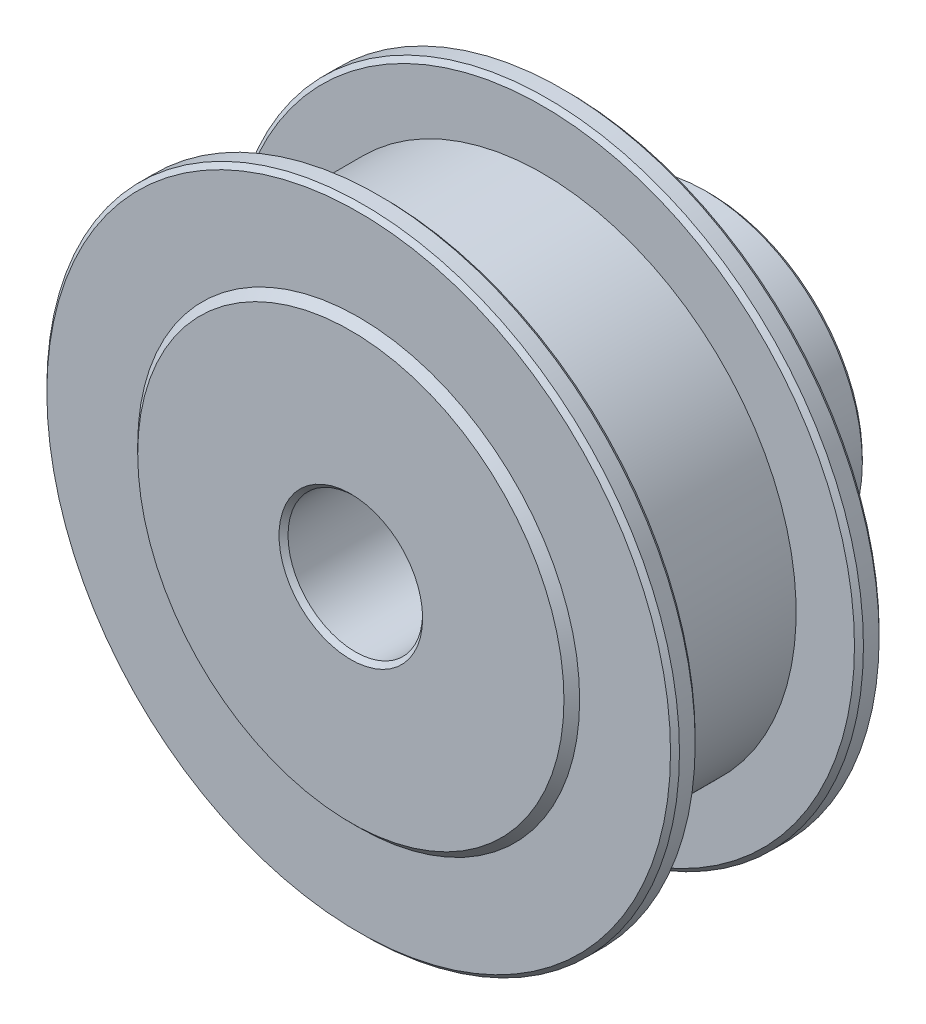
ISO-10303-21;
HEADER;
FILE_DESCRIPTION(('STEP AP214'),'2;1');
FILE_NAME('part.step','',(''),(''),'','','');
FILE_SCHEMA(('AUTOMOTIVE_DESIGN { 1 0 10303 214 1 1 1 1 }'));
ENDSEC;
DATA;
#1=APPLICATION_CONTEXT('core data for automotive mechanical design processes');
#2=APPLICATION_PROTOCOL_DEFINITION('international standard','automotive_design',2000,#1);
#3=PRODUCT_CONTEXT('',#1,'mechanical');
#4=PRODUCT('Part','Part','',(#3));
#5=PRODUCT_RELATED_PRODUCT_CATEGORY('part','',(#4));
#6=PRODUCT_DEFINITION_FORMATION('','',#4);
#7=PRODUCT_DEFINITION_CONTEXT('part definition',#1,'design');
#8=PRODUCT_DEFINITION('design','',#6,#7);
#9=PRODUCT_DEFINITION_SHAPE('','',#8);
#10=(LENGTH_UNIT() NAMED_UNIT(*) SI_UNIT(.MILLI.,.METRE.));
#11=(NAMED_UNIT(*) PLANE_ANGLE_UNIT() SI_UNIT($,.RADIAN.));
#12=(NAMED_UNIT(*) SI_UNIT($,.STERADIAN.) SOLID_ANGLE_UNIT());
#13=UNCERTAINTY_MEASURE_WITH_UNIT(LENGTH_MEASURE(1.E-05),#10,'distance_accuracy_value','');
#14=(GEOMETRIC_REPRESENTATION_CONTEXT(3) GLOBAL_UNCERTAINTY_ASSIGNED_CONTEXT((#13)) GLOBAL_UNIT_ASSIGNED_CONTEXT((#10,
#11,#12)) REPRESENTATION_CONTEXT('',''));
#15=CARTESIAN_POINT('',(0.,0.,0.));
#16=DIRECTION('',(0.,0.,1.));
#17=DIRECTION('',(1.,0.,0.));
#18=AXIS2_PLACEMENT_3D('',#15,#16,#17);
#19=CARTESIAN_POINT('',(0.,0.,9.3));
#20=DIRECTION('',(0.,0.,-1.));
#21=DIRECTION('',(-1.,0.,0.));
#22=AXIS2_PLACEMENT_3D('',#19,#20,#21);
#23=CYLINDRICAL_SURFACE('',#22,14.1);
#24=CARTESIAN_POINT('',(0.,0.,9.09999999999999));
#25=DIRECTION('',(0.,0.,1.));
#26=DIRECTION('',(1.,0.,0.));
#27=AXIS2_PLACEMENT_3D('',#24,#25,#26);
#28=CIRCLE('',#27,14.1);
#29=CARTESIAN_POINT('',(-14.1,0.,9.09999999999999));
#30=VERTEX_POINT('',#29);
#31=EDGE_CURVE('E63',#30,#30,#28,.F.);
#32=CARTESIAN_POINT('',(0.,0.,8.40000000000001));
#33=DIRECTION('',(0.,0.,1.));
#34=DIRECTION('',(1.,0.,0.));
#35=AXIS2_PLACEMENT_3D('',#32,#33,#34);
#36=CIRCLE('',#35,14.1);
#37=CARTESIAN_POINT('',(-14.1,0.,8.40000000000001));
#38=VERTEX_POINT('',#37);
#39=EDGE_CURVE('E66',#38,#38,#36,.T.);
#40=CARTESIAN_POINT('',(-14.1,0.,9.09999999999999));
#41=CARTESIAN_POINT('',(-14.1,0.,9.09270833333332));
#42=CARTESIAN_POINT('',(-14.1,0.,9.08541666666666));
#43=CARTESIAN_POINT('',(-14.1,0.,9.07083333333332));
#44=CARTESIAN_POINT('',(-14.1,0.,9.06354166666666));
#45=CARTESIAN_POINT('',(-14.1,0.,9.04895833333333));
#46=CARTESIAN_POINT('',(-14.1,0.,9.04166666666666));
#47=CARTESIAN_POINT('',(-14.1,0.,9.02708333333333));
#48=CARTESIAN_POINT('',(-14.1,0.,9.01979166666666));
#49=CARTESIAN_POINT('',(-14.1,0.,9.00520833333333));
#50=CARTESIAN_POINT('',(-14.1,0.,8.99791666666666));
#51=CARTESIAN_POINT('',(-14.1,0.,8.98333333333333));
#52=CARTESIAN_POINT('',(-14.1,0.,8.97604166666666));
#53=CARTESIAN_POINT('',(-14.1,0.,8.96145833333333));
#54=CARTESIAN_POINT('',(-14.1,0.,8.95416666666666));
#55=CARTESIAN_POINT('',(-14.1,0.,8.93958333333333));
#56=CARTESIAN_POINT('',(-14.1,0.,8.93229166666666));
#57=CARTESIAN_POINT('',(-14.1,0.,8.91770833333333));
#58=CARTESIAN_POINT('',(-14.1,0.,8.91041666666666));
#59=CARTESIAN_POINT('',(-14.1,0.,8.89583333333333));
#60=CARTESIAN_POINT('',(-14.1,0.,8.88854166666666));
#61=CARTESIAN_POINT('',(-14.1,0.,8.87395833333333));
#62=CARTESIAN_POINT('',(-14.1,0.,8.86666666666666));
#63=CARTESIAN_POINT('',(-14.1,0.,8.85208333333333));
#64=CARTESIAN_POINT('',(-14.1,0.,8.84479166666666));
#65=CARTESIAN_POINT('',(-14.1,0.,8.83020833333333));
#66=CARTESIAN_POINT('',(-14.1,0.,8.82291666666666));
#67=CARTESIAN_POINT('',(-14.1,0.,8.80833333333333));
#68=CARTESIAN_POINT('',(-14.1,0.,8.80104166666666));
#69=CARTESIAN_POINT('',(-14.1,0.,8.78645833333333));
#70=CARTESIAN_POINT('',(-14.1,0.,8.77916666666667));
#71=CARTESIAN_POINT('',(-14.1,0.,8.76458333333333));
#72=CARTESIAN_POINT('',(-14.1,0.,8.75729166666667));
#73=CARTESIAN_POINT('',(-14.1,0.,8.74270833333333));
#74=CARTESIAN_POINT('',(-14.1,0.,8.73541666666667));
#75=CARTESIAN_POINT('',(-14.1,0.,8.72083333333333));
#76=CARTESIAN_POINT('',(-14.1,0.,8.71354166666667));
#77=CARTESIAN_POINT('',(-14.1,0.,8.69895833333334));
#78=CARTESIAN_POINT('',(-14.1,0.,8.69166666666667));
#79=CARTESIAN_POINT('',(-14.1,0.,8.67708333333334));
#80=CARTESIAN_POINT('',(-14.1,0.,8.66979166666667));
#81=CARTESIAN_POINT('',(-14.1,0.,8.65520833333334));
#82=CARTESIAN_POINT('',(-14.1,0.,8.64791666666667));
#83=CARTESIAN_POINT('',(-14.1,0.,8.63333333333334));
#84=CARTESIAN_POINT('',(-14.1,0.,8.62604166666667));
#85=CARTESIAN_POINT('',(-14.1,0.,8.61145833333334));
#86=CARTESIAN_POINT('',(-14.1,0.,8.60416666666667));
#87=CARTESIAN_POINT('',(-14.1,0.,8.58958333333334));
#88=CARTESIAN_POINT('',(-14.1,0.,8.58229166666667));
#89=CARTESIAN_POINT('',(-14.1,0.,8.56770833333334));
#90=CARTESIAN_POINT('',(-14.1,0.,8.56041666666667));
#91=CARTESIAN_POINT('',(-14.1,0.,8.54583333333334));
#92=CARTESIAN_POINT('',(-14.1,0.,8.53854166666667));
#93=CARTESIAN_POINT('',(-14.1,0.,8.52395833333334));
#94=CARTESIAN_POINT('',(-14.1,0.,8.51666666666667));
#95=CARTESIAN_POINT('',(-14.1,0.,8.50208333333334));
#96=CARTESIAN_POINT('',(-14.1,0.,8.49479166666667));
#97=CARTESIAN_POINT('',(-14.1,0.,8.48020833333334));
#98=CARTESIAN_POINT('',(-14.1,0.,8.47291666666668));
#99=CARTESIAN_POINT('',(-14.1,0.,8.45833333333334));
#100=CARTESIAN_POINT('',(-14.1,0.,8.45104166666668));
#101=CARTESIAN_POINT('',(-14.1,0.,8.43645833333334));
#102=CARTESIAN_POINT('',(-14.1,0.,8.42916666666668));
#103=CARTESIAN_POINT('',(-14.1,0.,8.41458333333335));
#104=CARTESIAN_POINT('',(-14.1,0.,8.40729166666668));
#105=CARTESIAN_POINT('',(-14.1,0.,8.40000000000001));
#106=B_SPLINE_CURVE_WITH_KNOTS('',3,(#40,#41,#42,#43,#44,#45,#46,#47,#48,#49,#50,#51,#52,#53,
#54,#55,#56,#57,#58,#59,#60,#61,#62,#63,#64,#65,#66,#67,#68,#69,#70,#71,#72,#73,#74,#75,#76,#77,
#78,#79,#80,#81,#82,#83,#84,#85,#86,#87,#88,#89,#90,#91,#92,#93,#94,#95,#96,#97,#98,#99,#100,
#101,#102,#103,#104,#105),.UNSPECIFIED.,.F.,.F.,(4,2,2,2,2,2,2,2,2,2,2,2,2,2,2,2,2,2,2,2,2,2,2,
2,2,2,2,2,2,2,2,2,4),(0.,0.0218749999999993,0.0437499999999987,0.065624999999998,
0.0874999999999973,0.109374999999997,0.131249999999996,0.153124999999995,0.174999999999995,
0.196874999999994,0.218749999999993,0.240624999999993,0.262499999999992,0.284374999999991,
0.306249999999991,0.32812499999999,0.349999999999989,0.371874999999989,0.393749999999988,
0.415624999999987,0.437499999999987,0.459374999999986,0.481249999999985,0.503124999999985,
0.524999999999984,0.546874999999983,0.568749999999982,0.590624999999982,0.612499999999981,
0.63437499999998,0.65624999999998,0.678124999999977,0.699999999999978),.UNSPECIFIED.);
#107=EDGE_CURVE('BSEAM37',#30,#38,#106,.T.);
#108=ORIENTED_EDGE('',*,*,#31,.T.);
#109=ORIENTED_EDGE('',*,*,#39,.T.);
#110=ORIENTED_EDGE('',*,*,#107,.T.);
#111=ORIENTED_EDGE('',*,*,#107,.F.);
#112=EDGE_LOOP('',(#108,#110,#109,#111));
#113=FACE_BOUND('',#112,.T.);
#114=ADVANCED_FACE('F37',(#113),#23,.T.);
#115=CARTESIAN_POINT('',(0.,0.,9.3));
#116=DIRECTION('',(0.,0.,1.));
#117=DIRECTION('',(1.,0.,0.));
#118=AXIS2_PLACEMENT_3D('',#115,#116,#117);
#119=PLANE('',#118);
#120=CARTESIAN_POINT('',(0.,0.,9.3));
#121=DIRECTION('',(0.,0.,1.));
#122=DIRECTION('',(1.,0.,0.));
#123=AXIS2_PLACEMENT_3D('',#120,#121,#122);
#124=CIRCLE('',#123,13.9);
#125=CARTESIAN_POINT('',(-13.9,0.,9.3));
#126=VERTEX_POINT('',#125);
#127=EDGE_CURVE('E69',#126,#126,#124,.T.);
#128=ORIENTED_EDGE('',*,*,#127,.T.);
#129=EDGE_LOOP('',(#128));
#130=FACE_BOUND('',#129,.T.);
#131=CARTESIAN_POINT('',(0.,0.,9.3));
#132=DIRECTION('',(0.,0.,1.));
#133=DIRECTION('',(1.,0.,0.));
#134=AXIS2_PLACEMENT_3D('',#131,#132,#133);
#135=CIRCLE('',#134,9.85);
#136=CARTESIAN_POINT('',(9.85,0.,9.3));
#137=VERTEX_POINT('',#136);
#138=EDGE_CURVE('E105',#137,#137,#135,.F.);
#139=ORIENTED_EDGE('',*,*,#138,.T.);
#140=EDGE_LOOP('',(#139));
#141=FACE_BOUND('',#140,.T.);
#142=ADVANCED_FACE('F109',(#130,#141),#119,.T.);
#143=CARTESIAN_POINT('',(0.,14.1,8.2));
#144=DIRECTION('',(0.,0.,1.));
#145=DIRECTION('',(1.,0.,0.));
#146=AXIS2_PLACEMENT_3D('',#143,#144,#145);
#147=PLANE('',#146);
#148=CARTESIAN_POINT('',(0.,0.,8.2));
#149=DIRECTION('',(0.,0.,1.));
#150=DIRECTION('',(1.,0.,0.));
#151=AXIS2_PLACEMENT_3D('',#148,#149,#150);
#152=CIRCLE('',#151,13.9);
#153=CARTESIAN_POINT('',(13.9,0.,8.2));
#154=VERTEX_POINT('',#153);
#155=EDGE_CURVE('E60',#154,#154,#152,.F.);
#156=ORIENTED_EDGE('',*,*,#155,.T.);
#157=EDGE_LOOP('',(#156));
#158=FACE_BOUND('',#157,.T.);
#159=CARTESIAN_POINT('',(0.,0.,8.2));
#160=DIRECTION('',(0.,0.,-1.));
#161=DIRECTION('',(-1.,0.,0.));
#162=AXIS2_PLACEMENT_3D('',#159,#160,#161);
#163=CIRCLE('',#162,11.3);
#164=CARTESIAN_POINT('',(-11.3,0.,8.2));
#165=VERTEX_POINT('',#164);
#166=EDGE_CURVE('E99',#165,#165,#163,.T.);
#167=ORIENTED_EDGE('',*,*,#166,.F.);
#168=EDGE_LOOP('',(#167));
#169=FACE_BOUND('',#168,.T.);
#170=ADVANCED_FACE('F136',(#158,#169),#147,.F.);
#171=CARTESIAN_POINT('',(0.,0.,-0.465));
#172=DIRECTION('',(0.,0.,-1.));
#173=DIRECTION('',(-1.,0.,0.));
#174=AXIS2_PLACEMENT_3D('',#171,#172,#173);
#175=CYLINDRICAL_SURFACE('',#174,11.3);
#176=CARTESIAN_POINT('',(0.,0.,1.1));
#177=DIRECTION('',(0.,0.,-1.));
#178=DIRECTION('',(-1.,0.,0.));
#179=AXIS2_PLACEMENT_3D('',#176,#177,#178);
#180=CIRCLE('',#179,11.3);
#181=CARTESIAN_POINT('',(-11.3,0.,1.1));
#182=VERTEX_POINT('',#181);
#183=EDGE_CURVE('E102',#182,#182,#180,.T.);
#184=ORIENTED_EDGE('',*,*,#183,.F.);
#185=EDGE_LOOP('',(#184));
#186=FACE_BOUND('',#185,.T.);
#187=ORIENTED_EDGE('',*,*,#166,.T.);
#188=EDGE_LOOP('',(#187));
#189=FACE_BOUND('',#188,.T.);
#190=ADVANCED_FACE('F290',(#186,#189),#175,.T.);
#191=CARTESIAN_POINT('',(0.,14.1,1.1));
#192=DIRECTION('',(0.,0.,-1.));
#193=DIRECTION('',(-1.,0.,0.));
#194=AXIS2_PLACEMENT_3D('',#191,#192,#193);
#195=PLANE('',#194);
#196=CARTESIAN_POINT('',(0.,0.,1.1));
#197=DIRECTION('',(0.,0.,-1.));
#198=DIRECTION('',(-1.,0.,0.));
#199=AXIS2_PLACEMENT_3D('',#196,#197,#198);
#200=CIRCLE('',#199,13.9);
#201=CARTESIAN_POINT('',(-13.9,0.,1.1));
#202=VERTEX_POINT('',#201);
#203=EDGE_CURVE('E48',#202,#202,#200,.F.);
#204=ORIENTED_EDGE('',*,*,#203,.T.);
#205=EDGE_LOOP('',(#204));
#206=FACE_BOUND('',#205,.T.);
#207=ORIENTED_EDGE('',*,*,#183,.T.);
#208=EDGE_LOOP('',(#207));
#209=FACE_BOUND('',#208,.T.);
#210=ADVANCED_FACE('F147',(#206,#209),#195,.F.);
#211=CARTESIAN_POINT('',(0.,0.,0.));
#212=DIRECTION('',(0.,0.,1.));
#213=DIRECTION('',(1.,0.,0.));
#214=AXIS2_PLACEMENT_3D('',#211,#212,#213);
#215=PLANE('',#214);
#216=CARTESIAN_POINT('',(0.,0.,0.));
#217=DIRECTION('',(0.,0.,1.));
#218=DIRECTION('',(1.,0.,0.));
#219=AXIS2_PLACEMENT_3D('',#216,#217,#218);
#220=CIRCLE('',#219,13.9);
#221=CARTESIAN_POINT('',(13.9,0.,0.));
#222=VERTEX_POINT('',#221);
#223=EDGE_CURVE('E44',#222,#222,#220,.F.);
#224=ORIENTED_EDGE('',*,*,#223,.T.);
#225=EDGE_LOOP('',(#224));
#226=FACE_BOUND('',#225,.T.);
#227=CARTESIAN_POINT('',(0.,0.,0.));
#228=DIRECTION('',(0.,0.,1.));
#229=DIRECTION('',(1.,0.,0.));
#230=AXIS2_PLACEMENT_3D('',#227,#228,#229);
#231=CIRCLE('',#230,9.85);
#232=CARTESIAN_POINT('',(9.85,0.,0.));
#233=VERTEX_POINT('',#232);
#234=EDGE_CURVE('E96',#233,#233,#231,.F.);
#235=ORIENTED_EDGE('',*,*,#234,.F.);
#236=EDGE_LOOP('',(#235));
#237=FACE_BOUND('',#236,.T.);
#238=ADVANCED_FACE('F142',(#226,#237),#215,.F.);
#239=CARTESIAN_POINT('',(0.,0.,0.900000000000001));
#240=DIRECTION('',(0.,0.,-1.));
#241=DIRECTION('',(-1.,0.,0.));
#242=AXIS2_PLACEMENT_3D('',#239,#240,#241);
#243=CIRCLE('',#242,14.1);
#244=CARTESIAN_POINT('',(-14.1,0.,0.900000000000001));
#245=VERTEX_POINT('',#244);
#246=EDGE_CURVE('E52',#245,#245,#243,.T.);
#247=ORIENTED_EDGE('',*,*,#246,.T.);
#248=EDGE_LOOP('',(#247));
#249=FACE_BOUND('',#248,.T.);
#250=CARTESIAN_POINT('',(0.,0.,0.200000000000004));
#251=DIRECTION('',(0.,0.,1.));
#252=DIRECTION('',(1.,0.,0.));
#253=AXIS2_PLACEMENT_3D('',#250,#251,#252);
#254=CIRCLE('',#253,14.1);
#255=CARTESIAN_POINT('',(14.1,0.,0.200000000000004));
#256=VERTEX_POINT('',#255);
#257=EDGE_CURVE('E57',#256,#256,#254,.T.);
#258=ORIENTED_EDGE('',*,*,#257,.T.);
#259=EDGE_LOOP('',(#258));
#260=FACE_BOUND('',#259,.T.);
#261=ADVANCED_FACE('F126',(#249,#260),#23,.T.);
#262=CARTESIAN_POINT('',(0.,0.,-0.35));
#263=DIRECTION('',(0.,0.,1.));
#264=DIRECTION('',(1.,0.,0.));
#265=AXIS2_PLACEMENT_3D('',#262,#263,#264);
#266=PLANE('',#265);
#267=CARTESIAN_POINT('',(0.,0.,-0.35));
#268=DIRECTION('',(0.,0.,1.));
#269=DIRECTION('',(1.,0.,0.));
#270=AXIS2_PLACEMENT_3D('',#267,#268,#269);
#271=CIRCLE('',#270,7.);
#272=CARTESIAN_POINT('',(7.,0.,-0.35));
#273=VERTEX_POINT('',#272);
#274=EDGE_CURVE('E87',#273,#273,#271,.F.);
#275=ORIENTED_EDGE('',*,*,#274,.F.);
#276=EDGE_LOOP('',(#275));
#277=FACE_BOUND('',#276,.T.);
#278=CARTESIAN_POINT('',(0.,0.,-0.35));
#279=DIRECTION('',(0.,0.,1.));
#280=DIRECTION('',(1.,0.,0.));
#281=AXIS2_PLACEMENT_3D('',#278,#279,#280);
#282=CIRCLE('',#281,9.5);
#283=CARTESIAN_POINT('',(9.5,0.,-0.35));
#284=VERTEX_POINT('',#283);
#285=EDGE_CURVE('E90',#284,#284,#282,.F.);
#286=ORIENTED_EDGE('',*,*,#285,.T.);
#287=EDGE_LOOP('',(#286));
#288=FACE_BOUND('',#287,.T.);
#289=ADVANCED_FACE('F120',(#277,#288),#266,.F.);
#290=CARTESIAN_POINT('',(0.,0.,9.65));
#291=DIRECTION('',(0.,0.,1.));
#292=DIRECTION('',(1.,0.,0.));
#293=AXIS2_PLACEMENT_3D('',#290,#291,#292);
#294=PLANE('',#293);
#295=CARTESIAN_POINT('',(0.,0.,9.65));
#296=DIRECTION('',(0.,0.,1.));
#297=DIRECTION('',(1.,0.,0.));
#298=AXIS2_PLACEMENT_3D('',#295,#296,#297);
#299=CIRCLE('',#298,3.2);
#300=CARTESIAN_POINT('',(3.2,0.,9.65));
#301=VERTEX_POINT('',#300);
#302=EDGE_CURVE('E72',#301,#301,#299,.F.);
#303=ORIENTED_EDGE('',*,*,#302,.T.);
#304=EDGE_LOOP('',(#303));
#305=FACE_BOUND('',#304,.T.);
#306=CARTESIAN_POINT('',(0.,0.,9.65));
#307=DIRECTION('',(0.,0.,1.));
#308=DIRECTION('',(1.,0.,0.));
#309=AXIS2_PLACEMENT_3D('',#306,#307,#308);
#310=CIRCLE('',#309,9.50000000000001);
#311=CARTESIAN_POINT('',(9.50000000000001,0.,9.65));
#312=VERTEX_POINT('',#311);
#313=EDGE_CURVE('E93',#312,#312,#310,.T.);
#314=ORIENTED_EDGE('',*,*,#313,.T.);
#315=EDGE_LOOP('',(#314));
#316=FACE_BOUND('',#315,.T.);
#317=ADVANCED_FACE('F115',(#305,#316),#294,.T.);
#318=CARTESIAN_POINT('',(0.,0.,9.65));
#319=DIRECTION('',(0.,0.,-1.));
#320=DIRECTION('',(-1.,0.,0.));
#321=AXIS2_PLACEMENT_3D('',#318,#319,#320);
#322=CONICAL_SURFACE('',#321,9.50000000000001,0.785398163397446);
#323=ORIENTED_EDGE('',*,*,#138,.F.);
#324=EDGE_LOOP('',(#323));
#325=FACE_BOUND('',#324,.T.);
#326=ORIENTED_EDGE('',*,*,#313,.F.);
#327=EDGE_LOOP('',(#326));
#328=FACE_BOUND('',#327,.T.);
#329=ADVANCED_FACE('F111',(#325,#328),#322,.T.);
#330=CARTESIAN_POINT('',(0.,0.,0.));
#331=DIRECTION('',(0.,0.,1.));
#332=DIRECTION('',(1.,0.,0.));
#333=AXIS2_PLACEMENT_3D('',#330,#331,#332);
#334=CONICAL_SURFACE('',#333,9.85,0.785398163397456);
#335=ORIENTED_EDGE('',*,*,#285,.F.);
#336=EDGE_LOOP('',(#335));
#337=FACE_BOUND('',#336,.T.);
#338=ORIENTED_EDGE('',*,*,#234,.T.);
#339=EDGE_LOOP('',(#338));
#340=FACE_BOUND('',#339,.T.);
#341=ADVANCED_FACE('F114',(#337,#340),#334,.T.);
#342=CARTESIAN_POINT('',(0.,0.,-6.35));
#343=DIRECTION('',(0.,0.,1.));
#344=DIRECTION('',(1.,0.,0.));
#345=AXIS2_PLACEMENT_3D('',#342,#343,#344);
#346=CYLINDRICAL_SURFACE('',#345,7.);
#347=CARTESIAN_POINT('',(0.,0.,-6.15));
#348=DIRECTION('',(0.,0.,-1.));
#349=DIRECTION('',(-1.,0.,0.));
#350=AXIS2_PLACEMENT_3D('',#347,#348,#349);
#351=CIRCLE('',#350,7.);
#352=CARTESIAN_POINT('',(-7.,0.,-6.15));
#353=VERTEX_POINT('',#352);
#354=EDGE_CURVE('E10',#353,#353,#351,.F.);
#355=ORIENTED_EDGE('',*,*,#354,.T.);
#356=EDGE_LOOP('',(#355));
#357=FACE_BOUND('',#356,.T.);
#358=ORIENTED_EDGE('',*,*,#274,.T.);
#359=EDGE_LOOP('',(#358));
#360=FACE_BOUND('',#359,.T.);
#361=ADVANCED_FACE('F182',(#357,#360),#346,.T.);
#362=CARTESIAN_POINT('',(0.,0.,-6.35));
#363=DIRECTION('',(0.,0.,-1.));
#364=DIRECTION('',(-1.,0.,0.));
#365=AXIS2_PLACEMENT_3D('',#362,#363,#364);
#366=PLANE('',#365);
#367=CARTESIAN_POINT('',(0.,0.,-6.35));
#368=DIRECTION('',(0.,0.,-1.));
#369=DIRECTION('',(-1.,0.,0.));
#370=AXIS2_PLACEMENT_3D('',#367,#368,#369);
#371=CIRCLE('',#370,3.19999999999999);
#372=CARTESIAN_POINT('',(-3.19999999999999,0.,-6.35));
#373=VERTEX_POINT('',#372);
#374=EDGE_CURVE('E75',#373,#373,#371,.F.);
#375=ORIENTED_EDGE('',*,*,#374,.T.);
#376=EDGE_LOOP('',(#375));
#377=FACE_BOUND('',#376,.T.);
#378=CARTESIAN_POINT('',(0.,0.,-6.35));
#379=DIRECTION('',(0.,0.,-1.));
#380=DIRECTION('',(-1.,0.,0.));
#381=AXIS2_PLACEMENT_3D('',#378,#379,#380);
#382=CIRCLE('',#381,6.8);
#383=CARTESIAN_POINT('',(-6.8,0.,-6.35));
#384=VERTEX_POINT('',#383);
#385=EDGE_CURVE('E78',#384,#384,#382,.T.);
#386=ORIENTED_EDGE('',*,*,#385,.T.);
#387=EDGE_LOOP('',(#386));
#388=FACE_BOUND('',#387,.T.);
#389=ADVANCED_FACE('F187',(#377,#388),#366,.T.);
#390=CARTESIAN_POINT('',(0.,0.,9.651));
#391=DIRECTION('',(0.,0.,-1.));
#392=DIRECTION('',(-1.,0.,0.));
#393=AXIS2_PLACEMENT_3D('',#390,#391,#392);
#394=CYLINDRICAL_SURFACE('',#393,3.);
#395=CARTESIAN_POINT('',(0.,0.,-6.15000000000001));
#396=DIRECTION('',(0.,0.,-1.));
#397=DIRECTION('',(-1.,0.,0.));
#398=AXIS2_PLACEMENT_3D('',#395,#396,#397);
#399=CIRCLE('',#398,3.);
#400=CARTESIAN_POINT('',(-3.,0.,-6.15000000000001));
#401=VERTEX_POINT('',#400);
#402=EDGE_CURVE('E81',#401,#401,#399,.T.);
#403=ORIENTED_EDGE('',*,*,#402,.T.);
#404=EDGE_LOOP('',(#403));
#405=FACE_BOUND('',#404,.T.);
#406=CARTESIAN_POINT('',(0.,0.,9.45));
#407=DIRECTION('',(0.,0.,1.));
#408=DIRECTION('',(1.,0.,0.));
#409=AXIS2_PLACEMENT_3D('',#406,#407,#408);
#410=CIRCLE('',#409,3.);
#411=CARTESIAN_POINT('',(3.,0.,9.45));
#412=VERTEX_POINT('',#411);
#413=EDGE_CURVE('E84',#412,#412,#410,.T.);
#414=ORIENTED_EDGE('',*,*,#413,.T.);
#415=EDGE_LOOP('',(#414));
#416=FACE_BOUND('',#415,.T.);
#417=ADVANCED_FACE('F179',(#405,#416),#394,.F.);
#418=CARTESIAN_POINT('',(0.,0.,-6.15000000000001));
#419=DIRECTION('',(0.,0.,-1.));
#420=DIRECTION('',(-1.,0.,0.));
#421=AXIS2_PLACEMENT_3D('',#418,#419,#420);
#422=CONICAL_SURFACE('',#421,3.,0.785398163397454);
#423=ORIENTED_EDGE('',*,*,#374,.F.);
#424=EDGE_LOOP('',(#423));
#425=FACE_BOUND('',#424,.T.);
#426=ORIENTED_EDGE('',*,*,#402,.F.);
#427=EDGE_LOOP('',(#426));
#428=FACE_BOUND('',#427,.T.);
#429=ADVANCED_FACE('F175',(#425,#428),#422,.F.);
#430=CARTESIAN_POINT('',(0.,0.,9.65));
#431=DIRECTION('',(0.,0.,1.));
#432=DIRECTION('',(1.,0.,0.));
#433=AXIS2_PLACEMENT_3D('',#430,#431,#432);
#434=CONICAL_SURFACE('',#433,3.2,0.785398163397444);
#435=ORIENTED_EDGE('',*,*,#413,.F.);
#436=EDGE_LOOP('',(#435));
#437=FACE_BOUND('',#436,.T.);
#438=ORIENTED_EDGE('',*,*,#302,.F.);
#439=EDGE_LOOP('',(#438));
#440=FACE_BOUND('',#439,.T.);
#441=ADVANCED_FACE('F171',(#437,#440),#434,.F.);
#442=CARTESIAN_POINT('',(0.,0.,9.3));
#443=DIRECTION('',(0.,0.,-1.));
#444=DIRECTION('',(-1.,0.,0.));
#445=AXIS2_PLACEMENT_3D('',#442,#443,#444);
#446=CONICAL_SURFACE('',#445,13.9,0.785398163397431);
#447=CARTESIAN_POINT('',(-14.1,0.,9.09999999999999));
#448=CARTESIAN_POINT('',(-14.0979166666667,0.,9.10208333333332));
#449=CARTESIAN_POINT('',(-14.0958333333333,0.,9.10416666666665));
#450=CARTESIAN_POINT('',(-14.0916666666667,0.,9.10833333333332));
#451=CARTESIAN_POINT('',(-14.0895833333333,0.,9.11041666666666));
#452=CARTESIAN_POINT('',(-14.0854166666667,0.,9.11458333333332));
#453=CARTESIAN_POINT('',(-14.0833333333333,0.,9.11666666666666));
#454=CARTESIAN_POINT('',(-14.0791666666667,0.,9.12083333333332));
#455=CARTESIAN_POINT('',(-14.0770833333333,0.,9.12291666666666));
#456=CARTESIAN_POINT('',(-14.0729166666667,0.,9.12708333333332));
#457=CARTESIAN_POINT('',(-14.0708333333333,0.,9.12916666666666));
#458=CARTESIAN_POINT('',(-14.0666666666667,0.,9.13333333333332));
#459=CARTESIAN_POINT('',(-14.0645833333333,0.,9.13541666666666));
#460=CARTESIAN_POINT('',(-14.0604166666667,0.,9.13958333333332));
#461=CARTESIAN_POINT('',(-14.0583333333333,0.,9.14166666666666));
#462=CARTESIAN_POINT('',(-14.0541666666667,0.,9.14583333333333));
#463=CARTESIAN_POINT('',(-14.0520833333333,0.,9.14791666666666));
#464=CARTESIAN_POINT('',(-14.0479166666667,0.,9.15208333333332));
#465=CARTESIAN_POINT('',(-14.0458333333333,0.,9.15416666666666));
#466=CARTESIAN_POINT('',(-14.0416666666667,0.,9.15833333333333));
#467=CARTESIAN_POINT('',(-14.0395833333333,0.,9.16041666666666));
#468=CARTESIAN_POINT('',(-14.0354166666667,0.,9.16458333333333));
#469=CARTESIAN_POINT('',(-14.0333333333333,0.,9.16666666666666));
#470=CARTESIAN_POINT('',(-14.0291666666667,0.,9.17083333333333));
#471=CARTESIAN_POINT('',(-14.0270833333333,0.,9.17291666666666));
#472=CARTESIAN_POINT('',(-14.0229166666667,0.,9.17708333333333));
#473=CARTESIAN_POINT('',(-14.0208333333333,0.,9.17916666666666));
#474=CARTESIAN_POINT('',(-14.0166666666667,0.,9.18333333333333));
#475=CARTESIAN_POINT('',(-14.0145833333333,0.,9.18541666666666));
#476=CARTESIAN_POINT('',(-14.0104166666667,0.,9.18958333333333));
#477=CARTESIAN_POINT('',(-14.0083333333333,0.,9.19166666666666));
#478=CARTESIAN_POINT('',(-14.0041666666667,0.,9.19583333333333));
#479=CARTESIAN_POINT('',(-14.0020833333333,0.,9.19791666666666));
#480=CARTESIAN_POINT('',(-13.9979166666667,0.,9.20208333333333));
#481=CARTESIAN_POINT('',(-13.9958333333333,0.,9.20416666666666));
#482=CARTESIAN_POINT('',(-13.9916666666667,0.,9.20833333333333));
#483=CARTESIAN_POINT('',(-13.9895833333333,0.,9.21041666666666));
#484=CARTESIAN_POINT('',(-13.9854166666667,0.,9.21458333333333));
#485=CARTESIAN_POINT('',(-13.9833333333333,0.,9.21666666666666));
#486=CARTESIAN_POINT('',(-13.9791666666667,0.,9.22083333333333));
#487=CARTESIAN_POINT('',(-13.9770833333333,0.,9.22291666666666));
#488=CARTESIAN_POINT('',(-13.9729166666667,0.,9.22708333333333));
#489=CARTESIAN_POINT('',(-13.9708333333333,0.,9.22916666666666));
#490=CARTESIAN_POINT('',(-13.9666666666667,0.,9.23333333333333));
#491=CARTESIAN_POINT('',(-13.9645833333333,0.,9.23541666666666));
#492=CARTESIAN_POINT('',(-13.9604166666667,0.,9.23958333333333));
#493=CARTESIAN_POINT('',(-13.9583333333333,0.,9.24166666666666));
#494=CARTESIAN_POINT('',(-13.9541666666667,0.,9.24583333333333));
#495=CARTESIAN_POINT('',(-13.9520833333333,0.,9.24791666666667));
#496=CARTESIAN_POINT('',(-13.9479166666667,0.,9.25208333333333));
#497=CARTESIAN_POINT('',(-13.9458333333333,0.,9.25416666666666));
#498=CARTESIAN_POINT('',(-13.9416666666667,0.,9.25833333333333));
#499=CARTESIAN_POINT('',(-13.9395833333333,0.,9.26041666666666));
#500=CARTESIAN_POINT('',(-13.9354166666667,0.,9.26458333333333));
#501=CARTESIAN_POINT('',(-13.9333333333333,0.,9.26666666666667));
#502=CARTESIAN_POINT('',(-13.9291666666667,0.,9.27083333333333));
#503=CARTESIAN_POINT('',(-13.9270833333333,0.,9.27291666666667));
#504=CARTESIAN_POINT('',(-13.9229166666667,0.,9.27708333333333));
#505=CARTESIAN_POINT('',(-13.9208333333333,0.,9.27916666666667));
#506=CARTESIAN_POINT('',(-13.9166666666667,0.,9.28333333333333));
#507=CARTESIAN_POINT('',(-13.9145833333333,0.,9.28541666666667));
#508=CARTESIAN_POINT('',(-13.9104166666667,0.,9.28958333333333));
#509=CARTESIAN_POINT('',(-13.9083333333333,0.,9.29166666666667));
#510=CARTESIAN_POINT('',(-13.9041666666667,0.,9.29583333333333));
#511=CARTESIAN_POINT('',(-13.9020833333333,0.,9.29791666666667));
#512=CARTESIAN_POINT('',(-13.9,0.,9.3));
#513=B_SPLINE_CURVE_WITH_KNOTS('',3,(#447,#448,#449,#450,#451,#452,#453,#454,#455,#456,#457,
#458,#459,#460,#461,#462,#463,#464,#465,#466,#467,#468,#469,#470,#471,#472,#473,#474,#475,#476,
#477,#478,#479,#480,#481,#482,#483,#484,#485,#486,#487,#488,#489,#490,#491,#492,#493,#494,#495,
#496,#497,#498,#499,#500,#501,#502,#503,#504,#505,#506,#507,#508,#509,#510,#511,#512),
.UNSPECIFIED.,.F.,.F.,(4,2,2,2,2,2,2,2,2,2,2,2,2,2,2,2,2,2,2,2,2,2,2,2,2,2,2,2,2,2,2,2,4),(0.,
0.00883883476483332,0.0176776695296654,0.0265165042944975,0.0353553390593296,0.0441941738241617,
0.0530330085889938,0.0618718433538271,0.070710678118658,0.0795495128834913,0.0883883476483222,
0.0972271824131555,0.106066017177988,0.11490485194282,0.123743686707652,0.132582521472484,
0.141421356237316,0.150260191002148,0.15909902576698,0.167937860531812,0.176776695296644,
0.185615530061476,0.19445436482631,0.203293199591141,0.212132034355974,0.220970869120805,
0.229809703885638,0.23864853865047,0.247487373415302,0.256326208180134,0.265165042944967,
0.274003877709799,0.282842712474632),.UNSPECIFIED.);
#514=EDGE_CURVE('BSEAM167',#30,#126,#513,.T.);
#515=ORIENTED_EDGE('',*,*,#31,.F.);
#516=ORIENTED_EDGE('',*,*,#127,.F.);
#517=ORIENTED_EDGE('',*,*,#514,.T.);
#518=ORIENTED_EDGE('',*,*,#514,.F.);
#519=EDGE_LOOP('',(#515,#517,#516,#518));
#520=FACE_BOUND('',#519,.T.);
#521=ADVANCED_FACE('F167',(#520),#446,.T.);
#522=CARTESIAN_POINT('',(0.,0.,8.2));
#523=DIRECTION('',(0.,0.,1.));
#524=DIRECTION('',(1.,0.,0.));
#525=AXIS2_PLACEMENT_3D('',#522,#523,#524);
#526=CONICAL_SURFACE('',#525,13.9,0.785398163397431);
#527=ORIENTED_EDGE('',*,*,#39,.F.);
#528=EDGE_LOOP('',(#527));
#529=FACE_BOUND('',#528,.T.);
#530=ORIENTED_EDGE('',*,*,#155,.F.);
#531=EDGE_LOOP('',(#530));
#532=FACE_BOUND('',#531,.T.);
#533=ADVANCED_FACE('F161',(#529,#532),#526,.T.);
#534=CARTESIAN_POINT('',(0.,0.,0.900000000000001));
#535=DIRECTION('',(0.,0.,-1.));
#536=DIRECTION('',(-1.,0.,0.));
#537=AXIS2_PLACEMENT_3D('',#534,#535,#536);
#538=CONICAL_SURFACE('',#537,14.1,0.785398163397457);
#539=ORIENTED_EDGE('',*,*,#203,.F.);
#540=EDGE_LOOP('',(#539));
#541=FACE_BOUND('',#540,.T.);
#542=ORIENTED_EDGE('',*,*,#246,.F.);
#543=EDGE_LOOP('',(#542));
#544=FACE_BOUND('',#543,.T.);
#545=ADVANCED_FACE('F154',(#541,#544),#538,.T.);
#546=CARTESIAN_POINT('',(0.,0.,0.200000000000004));
#547=DIRECTION('',(0.,0.,1.));
#548=DIRECTION('',(1.,0.,0.));
#549=AXIS2_PLACEMENT_3D('',#546,#547,#548);
#550=CONICAL_SURFACE('',#549,14.1,0.785398163397448);
#551=ORIENTED_EDGE('',*,*,#223,.F.);
#552=EDGE_LOOP('',(#551));
#553=FACE_BOUND('',#552,.T.);
#554=ORIENTED_EDGE('',*,*,#257,.F.);
#555=EDGE_LOOP('',(#554));
#556=FACE_BOUND('',#555,.T.);
#557=ADVANCED_FACE('F152',(#553,#556),#550,.T.);
#558=CARTESIAN_POINT('',(0.,0.,-6.35));
#559=DIRECTION('',(0.,0.,1.));
#560=DIRECTION('',(1.,0.,0.));
#561=AXIS2_PLACEMENT_3D('',#558,#559,#560);
#562=CONICAL_SURFACE('',#561,6.8,0.78539816339745);
#563=ORIENTED_EDGE('',*,*,#354,.F.);
#564=EDGE_LOOP('',(#563));
#565=FACE_BOUND('',#564,.T.);
#566=ORIENTED_EDGE('',*,*,#385,.F.);
#567=EDGE_LOOP('',(#566));
#568=FACE_BOUND('',#567,.T.);
#569=ADVANCED_FACE('F39',(#565,#568),#562,.T.);
#570=CLOSED_SHELL('',(#114,#142,#170,#190,#210,#238,#261,#289,#317,#329,#341,#361,#389,#417,
#429,#441,#521,#533,#545,#557,#569));
#571=MANIFOLD_SOLID_BREP('B2',#570);
#572=ADVANCED_BREP_SHAPE_REPRESENTATION('',(#18,#571),#14);
#573=SHAPE_DEFINITION_REPRESENTATION(#9,#572);
ENDSEC;
END-ISO-10303-21;
